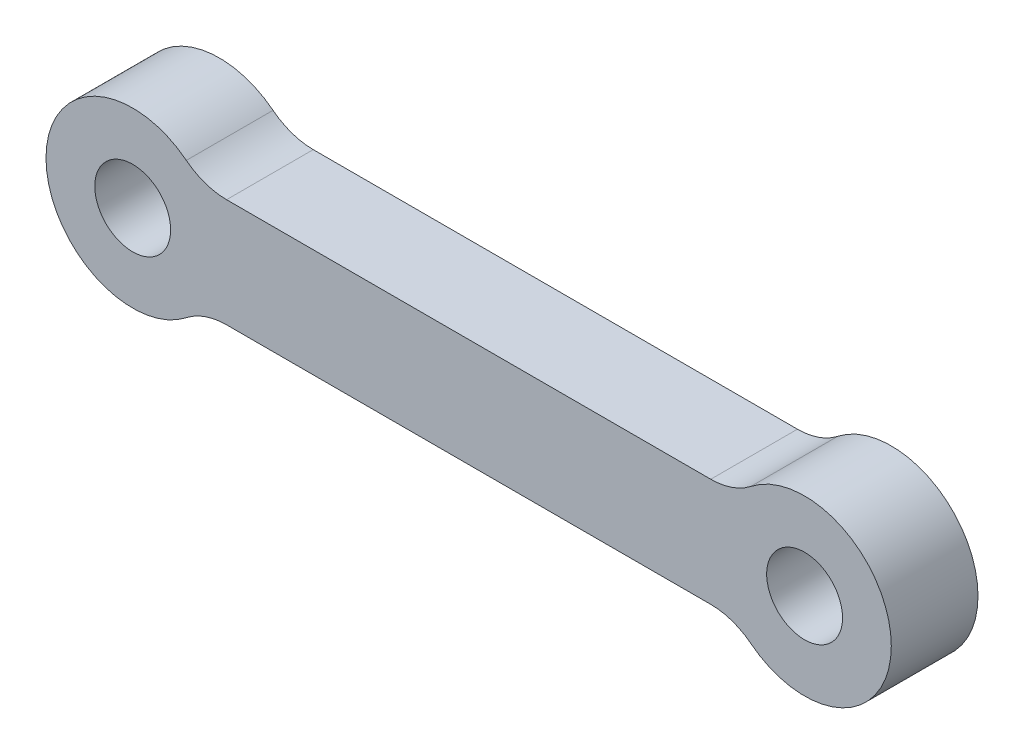
ISO-10303-21;
HEADER;
FILE_DESCRIPTION(('STEP AP214'),'2;1');
FILE_NAME('part.step','',(''),(''),'','','');
FILE_SCHEMA(('AUTOMOTIVE_DESIGN { 1 0 10303 214 1 1 1 1 }'));
ENDSEC;
DATA;
#1=APPLICATION_CONTEXT('core data for automotive mechanical design processes');
#2=APPLICATION_PROTOCOL_DEFINITION('international standard','automotive_design',2000,#1);
#3=PRODUCT_CONTEXT('',#1,'mechanical');
#4=PRODUCT('Part','Part','',(#3));
#5=PRODUCT_RELATED_PRODUCT_CATEGORY('part','',(#4));
#6=PRODUCT_DEFINITION_FORMATION('','',#4);
#7=PRODUCT_DEFINITION_CONTEXT('part definition',#1,'design');
#8=PRODUCT_DEFINITION('design','',#6,#7);
#9=PRODUCT_DEFINITION_SHAPE('','',#8);
#10=(LENGTH_UNIT() NAMED_UNIT(*) SI_UNIT(.MILLI.,.METRE.));
#11=(NAMED_UNIT(*) PLANE_ANGLE_UNIT() SI_UNIT($,.RADIAN.));
#12=(NAMED_UNIT(*) SI_UNIT($,.STERADIAN.) SOLID_ANGLE_UNIT());
#13=UNCERTAINTY_MEASURE_WITH_UNIT(LENGTH_MEASURE(1.E-05),#10,'distance_accuracy_value','');
#14=(GEOMETRIC_REPRESENTATION_CONTEXT(3) GLOBAL_UNCERTAINTY_ASSIGNED_CONTEXT((#13)) GLOBAL_UNIT_ASSIGNED_CONTEXT((#10,
#11,#12)) REPRESENTATION_CONTEXT('',''));
#15=CARTESIAN_POINT('',(0.,0.,0.));
#16=DIRECTION('',(0.,0.,1.));
#17=DIRECTION('',(1.,0.,0.));
#18=AXIS2_PLACEMENT_3D('',#15,#16,#17);
#19=CARTESIAN_POINT('',(0.,-2.5,2.));
#20=DIRECTION('',(0.,1.,0.));
#21=DIRECTION('',(0.,0.,1.));
#22=AXIS2_PLACEMENT_3D('',#19,#20,#21);
#23=PLANE('',#22);
#24=DIRECTION('',(1.,0.,0.));
#25=VECTOR('',#24,1.);
#26=CARTESIAN_POINT('',(0.,-2.5,-2.));
#27=LINE('',#26,#25);
#28=CARTESIAN_POINT('',(-11.1698729810778,-2.5,-2.));
#29=VERTEX_POINT('',#28);
#30=CARTESIAN_POINT('',(11.1698729810778,-2.5,-2.));
#31=VERTEX_POINT('',#30);
#32=EDGE_CURVE('E138',#29,#31,#27,.T.);
#33=ORIENTED_EDGE('',*,*,#32,.T.);
#34=DIRECTION('',(0.,0.,-1.));
#35=VECTOR('',#34,1.);
#36=CARTESIAN_POINT('',(11.1698729810778,-2.5,2.));
#37=LINE('',#36,#35);
#38=CARTESIAN_POINT('',(11.1698729810778,-2.5,2.));
#39=VERTEX_POINT('',#38);
#40=EDGE_CURVE('E162',#31,#39,#37,.F.);
#41=ORIENTED_EDGE('',*,*,#40,.T.);
#42=DIRECTION('',(1.,0.,0.));
#43=VECTOR('',#42,1.);
#44=CARTESIAN_POINT('',(0.,-2.5,2.));
#45=LINE('',#44,#43);
#46=CARTESIAN_POINT('',(-11.1698729810778,-2.5,2.));
#47=VERTEX_POINT('',#46);
#48=EDGE_CURVE('E225',#47,#39,#45,.T.);
#49=ORIENTED_EDGE('',*,*,#48,.F.);
#50=DIRECTION('',(0.,0.,1.));
#51=VECTOR('',#50,1.);
#52=CARTESIAN_POINT('',(-11.1698729810778,-2.5,-2.));
#53=LINE('',#52,#51);
#54=EDGE_CURVE('E149',#47,#29,#53,.F.);
#55=ORIENTED_EDGE('',*,*,#54,.T.);
#56=EDGE_LOOP('',(#33,#41,#49,#55));
#57=FACE_BOUND('',#56,.T.);
#58=ADVANCED_FACE('F47',(#57),#23,.F.);
#59=CARTESIAN_POINT('',(15.5,0.,2.));
#60=DIRECTION('',(0.,0.,-1.));
#61=DIRECTION('',(-1.,0.,0.));
#62=AXIS2_PLACEMENT_3D('',#59,#60,#61);
#63=CYLINDRICAL_SURFACE('',#62,4.);
#64=CARTESIAN_POINT('',(15.5,0.,2.));
#65=DIRECTION('',(0.,0.,1.));
#66=DIRECTION('',(1.,0.,0.));
#67=AXIS2_PLACEMENT_3D('',#64,#65,#66);
#68=CIRCLE('',#67,4.);
#69=CARTESIAN_POINT('',(13.025641703473,3.14285714285714,2.));
#70=VERTEX_POINT('',#69);
#71=CARTESIAN_POINT('',(13.025641703473,-3.14285714285714,2.));
#72=VERTEX_POINT('',#71);
#73=EDGE_CURVE('E211',#70,#72,#68,.F.);
#74=ORIENTED_EDGE('',*,*,#73,.T.);
#75=DIRECTION('',(0.,0.,-1.));
#76=VECTOR('',#75,1.);
#77=CARTESIAN_POINT('',(13.025641703473,-3.14285714285714,2.));
#78=LINE('',#77,#76);
#79=CARTESIAN_POINT('',(13.025641703473,-3.14285714285714,-2.));
#80=VERTEX_POINT('',#79);
#81=EDGE_CURVE('E136',#72,#80,#78,.T.);
#82=ORIENTED_EDGE('',*,*,#81,.T.);
#83=CARTESIAN_POINT('',(15.5,0.,-2.));
#84=DIRECTION('',(0.,0.,1.));
#85=DIRECTION('',(1.,0.,0.));
#86=AXIS2_PLACEMENT_3D('',#83,#84,#85);
#87=CIRCLE('',#86,4.);
#88=CARTESIAN_POINT('',(13.025641703473,3.14285714285714,-2.));
#89=VERTEX_POINT('',#88);
#90=EDGE_CURVE('E118',#89,#80,#87,.F.);
#91=ORIENTED_EDGE('',*,*,#90,.F.);
#92=DIRECTION('',(0.,0.,-1.));
#93=VECTOR('',#92,1.);
#94=CARTESIAN_POINT('',(13.025641703473,3.14285714285714,2.));
#95=LINE('',#94,#93);
#96=EDGE_CURVE('E133',#89,#70,#95,.F.);
#97=ORIENTED_EDGE('',*,*,#96,.T.);
#98=EDGE_LOOP('',(#74,#82,#91,#97));
#99=FACE_BOUND('',#98,.T.);
#100=ADVANCED_FACE('F132',(#99),#63,.T.);
#101=CARTESIAN_POINT('',(0.,2.5,2.));
#102=DIRECTION('',(0.,1.,0.));
#103=DIRECTION('',(0.,0.,1.));
#104=AXIS2_PLACEMENT_3D('',#101,#102,#103);
#105=PLANE('',#104);
#106=DIRECTION('',(1.,0.,0.));
#107=VECTOR('',#106,1.);
#108=CARTESIAN_POINT('',(0.,2.5,2.));
#109=LINE('',#108,#107);
#110=CARTESIAN_POINT('',(-11.1698729810778,2.5,2.));
#111=VERTEX_POINT('',#110);
#112=CARTESIAN_POINT('',(11.1698729810778,2.5,2.));
#113=VERTEX_POINT('',#112);
#114=EDGE_CURVE('E204',#111,#113,#109,.T.);
#115=ORIENTED_EDGE('',*,*,#114,.T.);
#116=DIRECTION('',(0.,0.,1.));
#117=VECTOR('',#116,1.);
#118=CARTESIAN_POINT('',(11.1698729810778,2.5,-2.));
#119=LINE('',#118,#117);
#120=CARTESIAN_POINT('',(11.1698729810778,2.5,-2.));
#121=VERTEX_POINT('',#120);
#122=EDGE_CURVE('E167',#113,#121,#119,.F.);
#123=ORIENTED_EDGE('',*,*,#122,.T.);
#124=DIRECTION('',(1.,0.,0.));
#125=VECTOR('',#124,1.);
#126=CARTESIAN_POINT('',(0.,2.5,-2.));
#127=LINE('',#126,#125);
#128=CARTESIAN_POINT('',(-11.1698729810778,2.5,-2.));
#129=VERTEX_POINT('',#128);
#130=EDGE_CURVE('E120',#129,#121,#127,.T.);
#131=ORIENTED_EDGE('',*,*,#130,.F.);
#132=DIRECTION('',(0.,0.,-1.));
#133=VECTOR('',#132,1.);
#134=CARTESIAN_POINT('',(-11.1698729810778,2.5,2.));
#135=LINE('',#134,#133);
#136=EDGE_CURVE('E165',#129,#111,#135,.F.);
#137=ORIENTED_EDGE('',*,*,#136,.T.);
#138=EDGE_LOOP('',(#115,#123,#131,#137));
#139=FACE_BOUND('',#138,.T.);
#140=ADVANCED_FACE('F197',(#139),#105,.T.);
#141=CARTESIAN_POINT('',(-15.5,0.,2.));
#142=DIRECTION('',(0.,0.,-1.));
#143=DIRECTION('',(-1.,0.,0.));
#144=AXIS2_PLACEMENT_3D('',#141,#142,#143);
#145=CYLINDRICAL_SURFACE('',#144,1.75);
#146=CARTESIAN_POINT('',(-15.5,0.,2.));
#147=DIRECTION('',(0.,0.,1.));
#148=DIRECTION('',(1.,0.,0.));
#149=AXIS2_PLACEMENT_3D('',#146,#147,#148);
#150=CIRCLE('',#149,1.75);
#151=CARTESIAN_POINT('',(-13.75,0.,2.));
#152=VERTEX_POINT('',#151);
#153=EDGE_CURVE('E153',#152,#152,#150,.T.);
#154=ORIENTED_EDGE('',*,*,#153,.T.);
#155=EDGE_LOOP('',(#154));
#156=FACE_BOUND('',#155,.T.);
#157=CARTESIAN_POINT('',(-15.5,0.,-2.));
#158=DIRECTION('',(0.,0.,1.));
#159=DIRECTION('',(1.,0.,0.));
#160=AXIS2_PLACEMENT_3D('',#157,#158,#159);
#161=CIRCLE('',#160,1.75);
#162=CARTESIAN_POINT('',(-13.75,0.,-2.));
#163=VERTEX_POINT('',#162);
#164=EDGE_CURVE('E218',#163,#163,#161,.T.);
#165=ORIENTED_EDGE('',*,*,#164,.F.);
#166=EDGE_LOOP('',(#165));
#167=FACE_BOUND('',#166,.T.);
#168=ADVANCED_FACE('F257',(#156,#167),#145,.F.);
#169=CARTESIAN_POINT('',(-15.5,0.,2.));
#170=DIRECTION('',(0.,0.,-1.));
#171=DIRECTION('',(-1.,0.,0.));
#172=AXIS2_PLACEMENT_3D('',#169,#170,#171);
#173=CYLINDRICAL_SURFACE('',#172,4.);
#174=CARTESIAN_POINT('',(-15.5,0.,-2.));
#175=DIRECTION('',(0.,0.,1.));
#176=DIRECTION('',(1.,0.,0.));
#177=AXIS2_PLACEMENT_3D('',#174,#175,#176);
#178=CIRCLE('',#177,4.);
#179=CARTESIAN_POINT('',(-13.025641703473,3.14285714285714,-2.));
#180=VERTEX_POINT('',#179);
#181=CARTESIAN_POINT('',(-13.025641703473,-3.14285714285714,-2.));
#182=VERTEX_POINT('',#181);
#183=EDGE_CURVE('E191',#180,#182,#178,.T.);
#184=ORIENTED_EDGE('',*,*,#183,.T.);
#185=DIRECTION('',(0.,0.,-1.));
#186=VECTOR('',#185,1.);
#187=CARTESIAN_POINT('',(-13.025641703473,-3.14285714285714,2.));
#188=LINE('',#187,#186);
#189=CARTESIAN_POINT('',(-13.025641703473,-3.14285714285714,2.));
#190=VERTEX_POINT('',#189);
#191=EDGE_CURVE('E63',#182,#190,#188,.F.);
#192=ORIENTED_EDGE('',*,*,#191,.T.);
#193=CARTESIAN_POINT('',(-15.5,0.,2.));
#194=DIRECTION('',(0.,0.,1.));
#195=DIRECTION('',(1.,0.,0.));
#196=AXIS2_PLACEMENT_3D('',#193,#194,#195);
#197=CIRCLE('',#196,4.);
#198=CARTESIAN_POINT('',(-13.025641703473,3.14285714285714,2.));
#199=VERTEX_POINT('',#198);
#200=EDGE_CURVE('E201',#199,#190,#197,.T.);
#201=ORIENTED_EDGE('',*,*,#200,.F.);
#202=DIRECTION('',(0.,0.,-1.));
#203=VECTOR('',#202,1.);
#204=CARTESIAN_POINT('',(-13.025641703473,3.14285714285714,2.));
#205=LINE('',#204,#203);
#206=EDGE_CURVE('E170',#199,#180,#205,.T.);
#207=ORIENTED_EDGE('',*,*,#206,.T.);
#208=EDGE_LOOP('',(#184,#192,#201,#207));
#209=FACE_BOUND('',#208,.T.);
#210=ADVANCED_FACE('F200',(#209),#173,.T.);
#211=CARTESIAN_POINT('',(15.5,0.,2.));
#212=DIRECTION('',(0.,0.,-1.));
#213=DIRECTION('',(-1.,0.,0.));
#214=AXIS2_PLACEMENT_3D('',#211,#212,#213);
#215=CYLINDRICAL_SURFACE('',#214,1.75);
#216=CARTESIAN_POINT('',(15.5,0.,2.));
#217=DIRECTION('',(0.,0.,1.));
#218=DIRECTION('',(1.,0.,0.));
#219=AXIS2_PLACEMENT_3D('',#216,#217,#218);
#220=CIRCLE('',#219,1.75);
#221=CARTESIAN_POINT('',(17.25,0.,2.));
#222=VERTEX_POINT('',#221);
#223=EDGE_CURVE('E143',#222,#222,#220,.F.);
#224=ORIENTED_EDGE('',*,*,#223,.F.);
#225=EDGE_LOOP('',(#224));
#226=FACE_BOUND('',#225,.T.);
#227=CARTESIAN_POINT('',(15.5,0.,-2.));
#228=DIRECTION('',(0.,0.,1.));
#229=DIRECTION('',(1.,0.,0.));
#230=AXIS2_PLACEMENT_3D('',#227,#228,#229);
#231=CIRCLE('',#230,1.75);
#232=CARTESIAN_POINT('',(17.25,0.,-2.));
#233=VERTEX_POINT('',#232);
#234=EDGE_CURVE('E156',#233,#233,#231,.F.);
#235=ORIENTED_EDGE('',*,*,#234,.T.);
#236=EDGE_LOOP('',(#235));
#237=FACE_BOUND('',#236,.T.);
#238=ADVANCED_FACE('F247',(#226,#237),#215,.F.);
#239=CARTESIAN_POINT('',(0.,0.,2.));
#240=DIRECTION('',(0.,0.,1.));
#241=DIRECTION('',(1.,0.,0.));
#242=AXIS2_PLACEMENT_3D('',#239,#240,#241);
#243=PLANE('',#242);
#244=ORIENTED_EDGE('',*,*,#200,.T.);
#245=CARTESIAN_POINT('',(-11.1698729810778,-5.5,2.));
#246=DIRECTION('',(0.,0.,1.));
#247=DIRECTION('',(1.,0.,0.));
#248=AXIS2_PLACEMENT_3D('',#245,#246,#247);
#249=CIRCLE('',#248,3.);
#250=EDGE_CURVE('E185',#190,#47,#249,.F.);
#251=ORIENTED_EDGE('',*,*,#250,.T.);
#252=ORIENTED_EDGE('',*,*,#48,.T.);
#253=CARTESIAN_POINT('',(11.1698729810778,-5.5,2.));
#254=DIRECTION('',(0.,0.,1.));
#255=DIRECTION('',(1.,0.,0.));
#256=AXIS2_PLACEMENT_3D('',#253,#254,#255);
#257=CIRCLE('',#256,3.);
#258=EDGE_CURVE('E127',#39,#72,#257,.F.);
#259=ORIENTED_EDGE('',*,*,#258,.T.);
#260=ORIENTED_EDGE('',*,*,#73,.F.);
#261=CARTESIAN_POINT('',(11.1698729810778,5.5,2.));
#262=DIRECTION('',(0.,0.,1.));
#263=DIRECTION('',(1.,0.,0.));
#264=AXIS2_PLACEMENT_3D('',#261,#262,#263);
#265=CIRCLE('',#264,3.);
#266=EDGE_CURVE('E126',#70,#113,#265,.F.);
#267=ORIENTED_EDGE('',*,*,#266,.T.);
#268=ORIENTED_EDGE('',*,*,#114,.F.);
#269=CARTESIAN_POINT('',(-11.1698729810778,5.5,2.));
#270=DIRECTION('',(0.,0.,1.));
#271=DIRECTION('',(1.,0.,0.));
#272=AXIS2_PLACEMENT_3D('',#269,#270,#271);
#273=CIRCLE('',#272,3.);
#274=EDGE_CURVE('E11',#111,#199,#273,.F.);
#275=ORIENTED_EDGE('',*,*,#274,.T.);
#276=EDGE_LOOP('',(#244,#251,#252,#259,#260,#267,#268,#275));
#277=FACE_BOUND('',#276,.T.);
#278=ORIENTED_EDGE('',*,*,#153,.F.);
#279=EDGE_LOOP('',(#278));
#280=FACE_BOUND('',#279,.T.);
#281=ORIENTED_EDGE('',*,*,#223,.T.);
#282=EDGE_LOOP('',(#281));
#283=FACE_BOUND('',#282,.T.);
#284=ADVANCED_FACE('F244',(#277,#280,#283),#243,.T.);
#285=CARTESIAN_POINT('',(0.,0.,-2.));
#286=DIRECTION('',(0.,0.,1.));
#287=DIRECTION('',(1.,0.,0.));
#288=AXIS2_PLACEMENT_3D('',#285,#286,#287);
#289=PLANE('',#288);
#290=ORIENTED_EDGE('',*,*,#32,.F.);
#291=CARTESIAN_POINT('',(-11.1698729810778,-5.5,-2.));
#292=DIRECTION('',(0.,0.,1.));
#293=DIRECTION('',(1.,0.,0.));
#294=AXIS2_PLACEMENT_3D('',#291,#292,#293);
#295=CIRCLE('',#294,3.);
#296=EDGE_CURVE('E182',#29,#182,#295,.T.);
#297=ORIENTED_EDGE('',*,*,#296,.T.);
#298=ORIENTED_EDGE('',*,*,#183,.F.);
#299=CARTESIAN_POINT('',(-11.1698729810778,5.5,-2.));
#300=DIRECTION('',(0.,0.,1.));
#301=DIRECTION('',(1.,0.,0.));
#302=AXIS2_PLACEMENT_3D('',#299,#300,#301);
#303=CIRCLE('',#302,3.);
#304=EDGE_CURVE('E56',#180,#129,#303,.T.);
#305=ORIENTED_EDGE('',*,*,#304,.T.);
#306=ORIENTED_EDGE('',*,*,#130,.T.);
#307=CARTESIAN_POINT('',(11.1698729810778,5.5,-2.));
#308=DIRECTION('',(0.,0.,1.));
#309=DIRECTION('',(1.,0.,0.));
#310=AXIS2_PLACEMENT_3D('',#307,#308,#309);
#311=CIRCLE('',#310,3.);
#312=EDGE_CURVE('E113',#121,#89,#311,.T.);
#313=ORIENTED_EDGE('',*,*,#312,.T.);
#314=ORIENTED_EDGE('',*,*,#90,.T.);
#315=CARTESIAN_POINT('',(11.1698729810778,-5.5,-2.));
#316=DIRECTION('',(0.,0.,1.));
#317=DIRECTION('',(1.,0.,0.));
#318=AXIS2_PLACEMENT_3D('',#315,#316,#317);
#319=CIRCLE('',#318,3.);
#320=EDGE_CURVE('E175',#80,#31,#319,.T.);
#321=ORIENTED_EDGE('',*,*,#320,.T.);
#322=EDGE_LOOP('',(#290,#297,#298,#305,#306,#313,#314,#321));
#323=FACE_BOUND('',#322,.T.);
#324=ORIENTED_EDGE('',*,*,#164,.T.);
#325=EDGE_LOOP('',(#324));
#326=FACE_BOUND('',#325,.T.);
#327=ORIENTED_EDGE('',*,*,#234,.F.);
#328=EDGE_LOOP('',(#327));
#329=FACE_BOUND('',#328,.T.);
#330=ADVANCED_FACE('F116',(#323,#326,#329),#289,.F.);
#331=CARTESIAN_POINT('',(11.1698729810778,-5.5,2.));
#332=DIRECTION('',(0.,0.,-1.));
#333=DIRECTION('',(-1.,0.,0.));
#334=AXIS2_PLACEMENT_3D('',#331,#332,#333);
#335=CYLINDRICAL_SURFACE('',#334,3.);
#336=ORIENTED_EDGE('',*,*,#258,.F.);
#337=ORIENTED_EDGE('',*,*,#40,.F.);
#338=ORIENTED_EDGE('',*,*,#320,.F.);
#339=ORIENTED_EDGE('',*,*,#81,.F.);
#340=EDGE_LOOP('',(#336,#337,#338,#339));
#341=FACE_BOUND('',#340,.T.);
#342=ADVANCED_FACE('F238',(#341),#335,.F.);
#343=CARTESIAN_POINT('',(11.1698729810778,5.5,2.));
#344=DIRECTION('',(0.,0.,-1.));
#345=DIRECTION('',(-1.,0.,0.));
#346=AXIS2_PLACEMENT_3D('',#343,#344,#345);
#347=CYLINDRICAL_SURFACE('',#346,3.);
#348=ORIENTED_EDGE('',*,*,#266,.F.);
#349=ORIENTED_EDGE('',*,*,#96,.F.);
#350=ORIENTED_EDGE('',*,*,#312,.F.);
#351=ORIENTED_EDGE('',*,*,#122,.F.);
#352=EDGE_LOOP('',(#348,#349,#350,#351));
#353=FACE_BOUND('',#352,.T.);
#354=ADVANCED_FACE('F141',(#353),#347,.F.);
#355=CARTESIAN_POINT('',(-11.1698729810778,-5.5,2.));
#356=DIRECTION('',(0.,0.,-1.));
#357=DIRECTION('',(-1.,0.,0.));
#358=AXIS2_PLACEMENT_3D('',#355,#356,#357);
#359=CYLINDRICAL_SURFACE('',#358,3.);
#360=ORIENTED_EDGE('',*,*,#250,.F.);
#361=ORIENTED_EDGE('',*,*,#191,.F.);
#362=ORIENTED_EDGE('',*,*,#296,.F.);
#363=ORIENTED_EDGE('',*,*,#54,.F.);
#364=EDGE_LOOP('',(#360,#361,#362,#363));
#365=FACE_BOUND('',#364,.T.);
#366=ADVANCED_FACE('F243',(#365),#359,.F.);
#367=CARTESIAN_POINT('',(-11.1698729810778,5.5,2.));
#368=DIRECTION('',(0.,0.,-1.));
#369=DIRECTION('',(-1.,0.,0.));
#370=AXIS2_PLACEMENT_3D('',#367,#368,#369);
#371=CYLINDRICAL_SURFACE('',#370,3.);
#372=ORIENTED_EDGE('',*,*,#274,.F.);
#373=ORIENTED_EDGE('',*,*,#136,.F.);
#374=ORIENTED_EDGE('',*,*,#304,.F.);
#375=ORIENTED_EDGE('',*,*,#206,.F.);
#376=EDGE_LOOP('',(#372,#373,#374,#375));
#377=FACE_BOUND('',#376,.T.);
#378=ADVANCED_FACE('F49',(#377),#371,.F.);
#379=CLOSED_SHELL('',(#58,#100,#140,#168,#210,#238,#284,#330,#342,#354,#366,#378));
#380=MANIFOLD_SOLID_BREP('B2',#379);
#381=ADVANCED_BREP_SHAPE_REPRESENTATION('',(#18,#380),#14);
#382=SHAPE_DEFINITION_REPRESENTATION(#9,#381);
ENDSEC;
END-ISO-10303-21;
